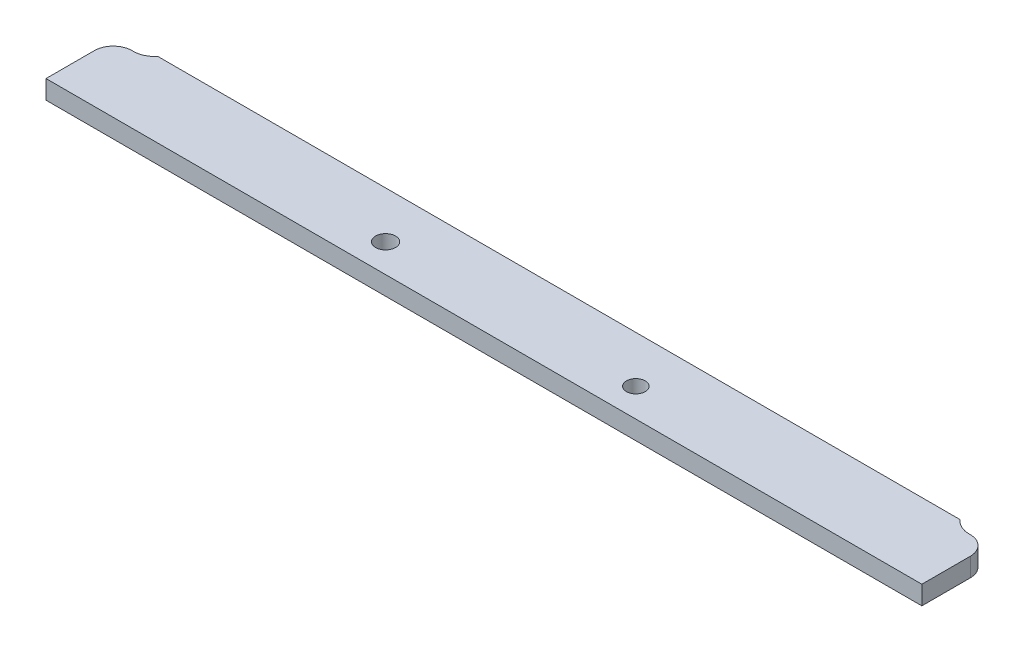
ISO-10303-21;
HEADER;
FILE_DESCRIPTION(('STEP AP214'),'2;1');
FILE_NAME('part.step','',(''),(''),'','','');
FILE_SCHEMA(('AUTOMOTIVE_DESIGN { 1 0 10303 214 1 1 1 1 }'));
ENDSEC;
DATA;
#1=APPLICATION_CONTEXT('core data for automotive mechanical design processes');
#2=APPLICATION_PROTOCOL_DEFINITION('international standard','automotive_design',2000,#1);
#3=PRODUCT_CONTEXT('',#1,'mechanical');
#4=PRODUCT('Part','Part','',(#3));
#5=PRODUCT_RELATED_PRODUCT_CATEGORY('part','',(#4));
#6=PRODUCT_DEFINITION_FORMATION('','',#4);
#7=PRODUCT_DEFINITION_CONTEXT('part definition',#1,'design');
#8=PRODUCT_DEFINITION('design','',#6,#7);
#9=PRODUCT_DEFINITION_SHAPE('','',#8);
#10=(LENGTH_UNIT() NAMED_UNIT(*) SI_UNIT(.MILLI.,.METRE.));
#11=(NAMED_UNIT(*) PLANE_ANGLE_UNIT() SI_UNIT($,.RADIAN.));
#12=(NAMED_UNIT(*) SI_UNIT($,.STERADIAN.) SOLID_ANGLE_UNIT());
#13=UNCERTAINTY_MEASURE_WITH_UNIT(LENGTH_MEASURE(1.E-05),#10,'distance_accuracy_value','');
#14=(GEOMETRIC_REPRESENTATION_CONTEXT(3) GLOBAL_UNCERTAINTY_ASSIGNED_CONTEXT((#13)) GLOBAL_UNIT_ASSIGNED_CONTEXT((#10,
#11,#12)) REPRESENTATION_CONTEXT('',''));
#15=CARTESIAN_POINT('',(0.,0.,0.));
#16=DIRECTION('',(0.,0.,1.));
#17=DIRECTION('',(1.,0.,0.));
#18=AXIS2_PLACEMENT_3D('',#15,#16,#17);
#19=CARTESIAN_POINT('',(128.180358537518,3.,-28.5998740388004));
#20=DIRECTION('',(0.,-1.,0.));
#21=DIRECTION('',(0.,0.,-1.));
#22=AXIS2_PLACEMENT_3D('',#19,#20,#21);
#23=CYLINDRICAL_SURFACE('',#22,3.5);
#24=CARTESIAN_POINT('',(128.180358537518,0.,-28.5998740388004));
#25=DIRECTION('',(0.,-1.,0.));
#26=DIRECTION('',(0.,0.,1.));
#27=AXIS2_PLACEMENT_3D('',#24,#25,#26);
#28=CIRCLE('',#27,3.5);
#29=CARTESIAN_POINT('',(128.180358537518,0.,-25.0998740388004));
#30=VERTEX_POINT('',#29);
#31=CARTESIAN_POINT('',(125.490280150114,0.,-26.3607942569216));
#32=VERTEX_POINT('',#31);
#33=EDGE_CURVE('E141',#30,#32,#28,.T.);
#34=ORIENTED_EDGE('',*,*,#33,.T.);
#35=DIRECTION('',(0.,-1.,0.));
#36=VECTOR('',#35,1.);
#37=CARTESIAN_POINT('',(125.490280150114,3.,-26.3607942569216));
#38=LINE('',#37,#36);
#39=CARTESIAN_POINT('',(125.490280150114,3.,-26.3607942569216));
#40=VERTEX_POINT('',#39);
#41=EDGE_CURVE('E11',#40,#32,#38,.T.);
#42=ORIENTED_EDGE('',*,*,#41,.F.);
#43=CARTESIAN_POINT('',(128.180358537518,3.,-28.5998740388004));
#44=DIRECTION('',(0.,-1.,0.));
#45=DIRECTION('',(0.,0.,1.));
#46=AXIS2_PLACEMENT_3D('',#43,#44,#45);
#47=CIRCLE('',#46,3.5);
#48=CARTESIAN_POINT('',(128.180358537518,3.,-25.0998740388004));
#49=VERTEX_POINT('',#48);
#50=EDGE_CURVE('E160',#49,#40,#47,.T.);
#51=ORIENTED_EDGE('',*,*,#50,.F.);
#52=DIRECTION('',(0.,-1.,0.));
#53=VECTOR('',#52,1.);
#54=CARTESIAN_POINT('',(128.180358537518,3.,-25.0998740388004));
#55=LINE('',#54,#53);
#56=EDGE_CURVE('E137',#49,#30,#55,.T.);
#57=ORIENTED_EDGE('',*,*,#56,.T.);
#58=EDGE_LOOP('',(#34,#42,#51,#57));
#59=FACE_BOUND('',#58,.T.);
#60=ADVANCED_FACE('F33',(#59),#23,.F.);
#61=CARTESIAN_POINT('',(125.490280150114,3.,-26.3607942569216));
#62=DIRECTION('',(0.,0.,1.));
#63=DIRECTION('',(1.,0.,0.));
#64=AXIS2_PLACEMENT_3D('',#61,#62,#63);
#65=PLANE('',#64);
#66=DIRECTION('',(-1.,0.,0.));
#67=VECTOR('',#66,1.);
#68=CARTESIAN_POINT('',(125.490280150114,0.,-26.3607942569216));
#69=LINE('',#68,#67);
#70=CARTESIAN_POINT('',(-2.74094444966359,0.,-26.3607942569216));
#71=VERTEX_POINT('',#70);
#72=EDGE_CURVE('E144',#32,#71,#69,.T.);
#73=ORIENTED_EDGE('',*,*,#72,.T.);
#74=DIRECTION('',(0.,-1.,0.));
#75=VECTOR('',#74,1.);
#76=CARTESIAN_POINT('',(-2.74094444966359,3.,-26.3607942569216));
#77=LINE('',#76,#75);
#78=CARTESIAN_POINT('',(-2.74094444966359,3.,-26.3607942569216));
#79=VERTEX_POINT('',#78);
#80=EDGE_CURVE('E41',#79,#71,#77,.T.);
#81=ORIENTED_EDGE('',*,*,#80,.F.);
#82=DIRECTION('',(-1.,0.,0.));
#83=VECTOR('',#82,1.);
#84=CARTESIAN_POINT('',(125.490280150114,3.,-26.3607942569216));
#85=LINE('',#84,#83);
#86=EDGE_CURVE('E98',#40,#79,#85,.T.);
#87=ORIENTED_EDGE('',*,*,#86,.F.);
#88=ORIENTED_EDGE('',*,*,#41,.T.);
#89=EDGE_LOOP('',(#73,#81,#87,#88));
#90=FACE_BOUND('',#89,.T.);
#91=ADVANCED_FACE('F242',(#90),#65,.F.);
#92=CARTESIAN_POINT('',(-5.43102283706826,3.,-28.5998740388004));
#93=DIRECTION('',(0.,-1.,0.));
#94=DIRECTION('',(0.,0.,-1.));
#95=AXIS2_PLACEMENT_3D('',#92,#93,#94);
#96=CYLINDRICAL_SURFACE('',#95,3.5);
#97=CARTESIAN_POINT('',(-5.43102283706826,0.,-28.5998740388004));
#98=DIRECTION('',(0.,-1.,0.));
#99=DIRECTION('',(0.,0.,1.));
#100=AXIS2_PLACEMENT_3D('',#97,#98,#99);
#101=CIRCLE('',#100,3.5);
#102=CARTESIAN_POINT('',(-5.43102283706826,0.,-25.0998740388004));
#103=VERTEX_POINT('',#102);
#104=EDGE_CURVE('E147',#71,#103,#101,.T.);
#105=ORIENTED_EDGE('',*,*,#104,.T.);
#106=DIRECTION('',(0.,-1.,0.));
#107=VECTOR('',#106,1.);
#108=CARTESIAN_POINT('',(-5.43102283706826,3.,-25.0998740388004));
#109=LINE('',#108,#107);
#110=CARTESIAN_POINT('',(-5.43102283706826,3.,-25.0998740388004));
#111=VERTEX_POINT('',#110);
#112=EDGE_CURVE('E173',#111,#103,#109,.T.);
#113=ORIENTED_EDGE('',*,*,#112,.F.);
#114=CARTESIAN_POINT('',(-5.43102283706826,3.,-28.5998740388004));
#115=DIRECTION('',(0.,-1.,0.));
#116=DIRECTION('',(0.,0.,1.));
#117=AXIS2_PLACEMENT_3D('',#114,#115,#116);
#118=CIRCLE('',#117,3.5);
#119=EDGE_CURVE('E181',#79,#111,#118,.T.);
#120=ORIENTED_EDGE('',*,*,#119,.F.);
#121=ORIENTED_EDGE('',*,*,#80,.T.);
#122=EDGE_LOOP('',(#105,#113,#120,#121));
#123=FACE_BOUND('',#122,.T.);
#124=ADVANCED_FACE('F179',(#123),#96,.F.);
#125=CARTESIAN_POINT('',(-5.43102283706826,3.,-25.0998740388004));
#126=DIRECTION('',(0.,0.,1.));
#127=DIRECTION('',(1.,0.,0.));
#128=AXIS2_PLACEMENT_3D('',#125,#126,#127);
#129=PLANE('',#128);
#130=DIRECTION('',(-1.,0.,0.));
#131=VECTOR('',#130,1.);
#132=CARTESIAN_POINT('',(-5.43102283706826,0.,-25.0998740388004));
#133=LINE('',#132,#131);
#134=CARTESIAN_POINT('',(-5.62533214977496,0.,-25.0998740388004));
#135=VERTEX_POINT('',#134);
#136=EDGE_CURVE('E149',#103,#135,#133,.T.);
#137=ORIENTED_EDGE('',*,*,#136,.T.);
#138=DIRECTION('',(0.,-1.,0.));
#139=VECTOR('',#138,1.);
#140=CARTESIAN_POINT('',(-5.62533214977496,3.,-25.0998740388004));
#141=LINE('',#140,#139);
#142=CARTESIAN_POINT('',(-5.62533214977496,3.,-25.0998740388004));
#143=VERTEX_POINT('',#142);
#144=EDGE_CURVE('E170',#143,#135,#141,.T.);
#145=ORIENTED_EDGE('',*,*,#144,.F.);
#146=DIRECTION('',(-1.,0.,0.));
#147=VECTOR('',#146,1.);
#148=CARTESIAN_POINT('',(-5.43102283706826,3.,-25.0998740388004));
#149=LINE('',#148,#147);
#150=EDGE_CURVE('E199',#111,#143,#149,.T.);
#151=ORIENTED_EDGE('',*,*,#150,.F.);
#152=ORIENTED_EDGE('',*,*,#112,.T.);
#153=EDGE_LOOP('',(#137,#145,#151,#152));
#154=FACE_BOUND('',#153,.T.);
#155=ADVANCED_FACE('F190',(#154),#129,.F.);
#156=CARTESIAN_POINT('',(-5.62533214977497,3.,-22.0998740388004));
#157=DIRECTION('',(0.,-1.,0.));
#158=DIRECTION('',(0.,0.,-1.));
#159=AXIS2_PLACEMENT_3D('',#156,#157,#158);
#160=CYLINDRICAL_SURFACE('',#159,3.);
#161=CARTESIAN_POINT('',(-5.62533214977497,0.,-22.0998740388004));
#162=DIRECTION('',(0.,1.,0.));
#163=DIRECTION('',(0.,0.,1.));
#164=AXIS2_PLACEMENT_3D('',#161,#162,#163);
#165=CIRCLE('',#164,3.);
#166=CARTESIAN_POINT('',(-8.62533214977497,0.,-22.0998740388004));
#167=VERTEX_POINT('',#166);
#168=EDGE_CURVE('E151',#135,#167,#165,.T.);
#169=ORIENTED_EDGE('',*,*,#168,.T.);
#170=DIRECTION('',(0.,-1.,0.));
#171=VECTOR('',#170,1.);
#172=CARTESIAN_POINT('',(-8.62533214977497,3.,-22.0998740388004));
#173=LINE('',#172,#171);
#174=CARTESIAN_POINT('',(-8.62533214977497,3.,-22.0998740388004));
#175=VERTEX_POINT('',#174);
#176=EDGE_CURVE('E167',#175,#167,#173,.T.);
#177=ORIENTED_EDGE('',*,*,#176,.F.);
#178=CARTESIAN_POINT('',(-5.62533214977497,3.,-22.0998740388004));
#179=DIRECTION('',(0.,1.,0.));
#180=DIRECTION('',(0.,0.,1.));
#181=AXIS2_PLACEMENT_3D('',#178,#179,#180);
#182=CIRCLE('',#181,3.);
#183=EDGE_CURVE('E196',#143,#175,#182,.T.);
#184=ORIENTED_EDGE('',*,*,#183,.F.);
#185=ORIENTED_EDGE('',*,*,#144,.T.);
#186=EDGE_LOOP('',(#169,#177,#184,#185));
#187=FACE_BOUND('',#186,.T.);
#188=ADVANCED_FACE('F194',(#187),#160,.T.);
#189=CARTESIAN_POINT('',(-8.62533214977497,3.,-22.0998740388004));
#190=DIRECTION('',(1.,0.,0.));
#191=DIRECTION('',(0.,0.,-1.));
#192=AXIS2_PLACEMENT_3D('',#189,#190,#191);
#193=PLANE('',#192);
#194=DIRECTION('',(0.,0.,1.));
#195=VECTOR('',#194,1.);
#196=CARTESIAN_POINT('',(-8.62533214977497,0.,-22.0998740388004));
#197=LINE('',#196,#195);
#198=CARTESIAN_POINT('',(-8.62533214977497,0.,-14.3588941767466));
#199=VERTEX_POINT('',#198);
#200=EDGE_CURVE('E153',#167,#199,#197,.T.);
#201=ORIENTED_EDGE('',*,*,#200,.T.);
#202=DIRECTION('',(0.,-1.,0.));
#203=VECTOR('',#202,1.);
#204=CARTESIAN_POINT('',(-8.62533214977497,3.,-14.3588941767466));
#205=LINE('',#204,#203);
#206=CARTESIAN_POINT('',(-8.62533214977497,3.,-14.3588941767466));
#207=VERTEX_POINT('',#206);
#208=EDGE_CURVE('E164',#207,#199,#205,.T.);
#209=ORIENTED_EDGE('',*,*,#208,.F.);
#210=DIRECTION('',(0.,0.,1.));
#211=VECTOR('',#210,1.);
#212=CARTESIAN_POINT('',(-8.62533214977497,3.,-22.0998740388004));
#213=LINE('',#212,#211);
#214=EDGE_CURVE('E198',#175,#207,#213,.T.);
#215=ORIENTED_EDGE('',*,*,#214,.F.);
#216=ORIENTED_EDGE('',*,*,#176,.T.);
#217=EDGE_LOOP('',(#201,#209,#215,#216));
#218=FACE_BOUND('',#217,.T.);
#219=ADVANCED_FACE('F254',(#218),#193,.F.);
#220=CARTESIAN_POINT('',(-8.62533214977497,3.,-14.3588941767466));
#221=DIRECTION('',(0.,0.,-1.));
#222=DIRECTION('',(-1.,0.,0.));
#223=AXIS2_PLACEMENT_3D('',#220,#221,#222);
#224=PLANE('',#223);
#225=DIRECTION('',(1.,0.,0.));
#226=VECTOR('',#225,1.);
#227=CARTESIAN_POINT('',(-8.62533214977497,0.,-14.3588941767466));
#228=LINE('',#227,#226);
#229=CARTESIAN_POINT('',(131.374667850225,0.,-14.3588941767466));
#230=VERTEX_POINT('',#229);
#231=EDGE_CURVE('E155',#199,#230,#228,.T.);
#232=ORIENTED_EDGE('',*,*,#231,.T.);
#233=DIRECTION('',(0.,-1.,0.));
#234=VECTOR('',#233,1.);
#235=CARTESIAN_POINT('',(131.374667850225,3.,-14.3588941767466));
#236=LINE('',#235,#234);
#237=CARTESIAN_POINT('',(131.374667850225,3.,-14.3588941767466));
#238=VERTEX_POINT('',#237);
#239=EDGE_CURVE('E132',#238,#230,#236,.T.);
#240=ORIENTED_EDGE('',*,*,#239,.F.);
#241=DIRECTION('',(1.,0.,0.));
#242=VECTOR('',#241,1.);
#243=CARTESIAN_POINT('',(-8.62533214977497,3.,-14.3588941767466));
#244=LINE('',#243,#242);
#245=EDGE_CURVE('E123',#207,#238,#244,.T.);
#246=ORIENTED_EDGE('',*,*,#245,.F.);
#247=ORIENTED_EDGE('',*,*,#208,.T.);
#248=EDGE_LOOP('',(#232,#240,#246,#247));
#249=FACE_BOUND('',#248,.T.);
#250=ADVANCED_FACE('F251',(#249),#224,.F.);
#251=CARTESIAN_POINT('',(131.374667850225,3.,-14.3588941767466));
#252=DIRECTION('',(-1.,0.,0.));
#253=DIRECTION('',(0.,0.,1.));
#254=AXIS2_PLACEMENT_3D('',#251,#252,#253);
#255=PLANE('',#254);
#256=DIRECTION('',(0.,0.,-1.));
#257=VECTOR('',#256,1.);
#258=CARTESIAN_POINT('',(131.374667850225,0.,-14.3588941767466));
#259=LINE('',#258,#257);
#260=CARTESIAN_POINT('',(131.374667850225,0.,-22.0998740388004));
#261=VERTEX_POINT('',#260);
#262=EDGE_CURVE('E131',#230,#261,#259,.T.);
#263=ORIENTED_EDGE('',*,*,#262,.T.);
#264=DIRECTION('',(0.,-1.,0.));
#265=VECTOR('',#264,1.);
#266=CARTESIAN_POINT('',(131.374667850225,3.,-22.0998740388004));
#267=LINE('',#266,#265);
#268=CARTESIAN_POINT('',(131.374667850225,3.,-22.0998740388004));
#269=VERTEX_POINT('',#268);
#270=EDGE_CURVE('E128',#269,#261,#267,.T.);
#271=ORIENTED_EDGE('',*,*,#270,.F.);
#272=DIRECTION('',(0.,0.,-1.));
#273=VECTOR('',#272,1.);
#274=CARTESIAN_POINT('',(131.374667850225,3.,-14.3588941767466));
#275=LINE('',#274,#273);
#276=EDGE_CURVE('E117',#238,#269,#275,.T.);
#277=ORIENTED_EDGE('',*,*,#276,.F.);
#278=ORIENTED_EDGE('',*,*,#239,.T.);
#279=EDGE_LOOP('',(#263,#271,#277,#278));
#280=FACE_BOUND('',#279,.T.);
#281=ADVANCED_FACE('F129',(#280),#255,.F.);
#282=CARTESIAN_POINT('',(128.374667850225,3.,-22.0998740388004));
#283=DIRECTION('',(0.,-1.,0.));
#284=DIRECTION('',(0.,0.,-1.));
#285=AXIS2_PLACEMENT_3D('',#282,#283,#284);
#286=CYLINDRICAL_SURFACE('',#285,3.);
#287=CARTESIAN_POINT('',(128.374667850225,0.,-22.0998740388004));
#288=DIRECTION('',(0.,1.,0.));
#289=DIRECTION('',(0.,0.,1.));
#290=AXIS2_PLACEMENT_3D('',#287,#288,#289);
#291=CIRCLE('',#290,3.);
#292=CARTESIAN_POINT('',(128.374667850225,0.,-25.0998740388004));
#293=VERTEX_POINT('',#292);
#294=EDGE_CURVE('E84',#261,#293,#291,.T.);
#295=ORIENTED_EDGE('',*,*,#294,.T.);
#296=DIRECTION('',(0.,-1.,0.));
#297=VECTOR('',#296,1.);
#298=CARTESIAN_POINT('',(128.374667850225,3.,-25.0998740388004));
#299=LINE('',#298,#297);
#300=CARTESIAN_POINT('',(128.374667850225,3.,-25.0998740388004));
#301=VERTEX_POINT('',#300);
#302=EDGE_CURVE('E133',#301,#293,#299,.T.);
#303=ORIENTED_EDGE('',*,*,#302,.F.);
#304=CARTESIAN_POINT('',(128.374667850225,3.,-22.0998740388004));
#305=DIRECTION('',(0.,1.,0.));
#306=DIRECTION('',(0.,0.,1.));
#307=AXIS2_PLACEMENT_3D('',#304,#305,#306);
#308=CIRCLE('',#307,3.);
#309=EDGE_CURVE('E121',#269,#301,#308,.T.);
#310=ORIENTED_EDGE('',*,*,#309,.F.);
#311=ORIENTED_EDGE('',*,*,#270,.T.);
#312=EDGE_LOOP('',(#295,#303,#310,#311));
#313=FACE_BOUND('',#312,.T.);
#314=ADVANCED_FACE('F135',(#313),#286,.T.);
#315=CARTESIAN_POINT('',(128.374667850225,3.,-25.0998740388004));
#316=DIRECTION('',(0.,0.,1.));
#317=DIRECTION('',(1.,0.,0.));
#318=AXIS2_PLACEMENT_3D('',#315,#316,#317);
#319=PLANE('',#318);
#320=DIRECTION('',(-1.,0.,0.));
#321=VECTOR('',#320,1.);
#322=CARTESIAN_POINT('',(128.374667850225,0.,-25.0998740388004));
#323=LINE('',#322,#321);
#324=EDGE_CURVE('E90',#293,#30,#323,.T.);
#325=ORIENTED_EDGE('',*,*,#324,.T.);
#326=ORIENTED_EDGE('',*,*,#56,.F.);
#327=DIRECTION('',(-1.,0.,0.));
#328=VECTOR('',#327,1.);
#329=CARTESIAN_POINT('',(128.374667850225,3.,-25.0998740388004));
#330=LINE('',#329,#328);
#331=EDGE_CURVE('E49',#301,#49,#330,.T.);
#332=ORIENTED_EDGE('',*,*,#331,.F.);
#333=ORIENTED_EDGE('',*,*,#302,.T.);
#334=EDGE_LOOP('',(#325,#326,#332,#333));
#335=FACE_BOUND('',#334,.T.);
#336=ADVANCED_FACE('F224',(#335),#319,.F.);
#337=CARTESIAN_POINT('',(128.180358537518,3.,-28.5998740388004));
#338=DIRECTION('',(0.,1.,0.));
#339=DIRECTION('',(0.,0.,1.));
#340=AXIS2_PLACEMENT_3D('',#337,#338,#339);
#341=PLANE('',#340);
#342=CARTESIAN_POINT('',(41.1097970990968,3.,-18.9031140667815));
#343=DIRECTION('',(0.,1.,0.));
#344=DIRECTION('',(0.,0.,1.));
#345=AXIS2_PLACEMENT_3D('',#342,#343,#344);
#346=CIRCLE('',#345,1.6);
#347=CARTESIAN_POINT('',(41.1097970990968,3.,-17.3031140667815));
#348=VERTEX_POINT('',#347);
#349=EDGE_CURVE('E210',#348,#348,#346,.T.);
#350=ORIENTED_EDGE('',*,*,#349,.F.);
#351=EDGE_LOOP('',(#350));
#352=FACE_BOUND('',#351,.T.);
#353=CARTESIAN_POINT('',(81.1097970990968,3.,-18.9031140667815));
#354=DIRECTION('',(0.,1.,0.));
#355=DIRECTION('',(0.,0.,1.));
#356=AXIS2_PLACEMENT_3D('',#353,#354,#355);
#357=CIRCLE('',#356,1.5);
#358=CARTESIAN_POINT('',(81.1097970990968,3.,-17.4031140667815));
#359=VERTEX_POINT('',#358);
#360=EDGE_CURVE('E211',#359,#359,#357,.T.);
#361=ORIENTED_EDGE('',*,*,#360,.F.);
#362=EDGE_LOOP('',(#361));
#363=FACE_BOUND('',#362,.T.);
#364=ORIENTED_EDGE('',*,*,#50,.T.);
#365=ORIENTED_EDGE('',*,*,#86,.T.);
#366=ORIENTED_EDGE('',*,*,#119,.T.);
#367=ORIENTED_EDGE('',*,*,#150,.T.);
#368=ORIENTED_EDGE('',*,*,#183,.T.);
#369=ORIENTED_EDGE('',*,*,#214,.T.);
#370=ORIENTED_EDGE('',*,*,#245,.T.);
#371=ORIENTED_EDGE('',*,*,#276,.T.);
#372=ORIENTED_EDGE('',*,*,#309,.T.);
#373=ORIENTED_EDGE('',*,*,#331,.T.);
#374=EDGE_LOOP('',(#364,#365,#366,#367,#368,#369,#370,#371,#372,#373));
#375=FACE_BOUND('',#374,.T.);
#376=ADVANCED_FACE('F119',(#352,#363,#375),#341,.T.);
#377=CARTESIAN_POINT('',(128.180358537518,0.,-28.5998740388004));
#378=DIRECTION('',(0.,1.,0.));
#379=DIRECTION('',(0.,0.,1.));
#380=AXIS2_PLACEMENT_3D('',#377,#378,#379);
#381=PLANE('',#380);
#382=CARTESIAN_POINT('',(41.1097970990968,0.,-18.9031140667815));
#383=DIRECTION('',(0.,1.,0.));
#384=DIRECTION('',(0.,0.,1.));
#385=AXIS2_PLACEMENT_3D('',#382,#383,#384);
#386=CIRCLE('',#385,1.6);
#387=CARTESIAN_POINT('',(41.1097970990968,0.,-17.3031140667815));
#388=VERTEX_POINT('',#387);
#389=EDGE_CURVE('E145',#388,#388,#386,.F.);
#390=ORIENTED_EDGE('',*,*,#389,.F.);
#391=EDGE_LOOP('',(#390));
#392=FACE_BOUND('',#391,.T.);
#393=CARTESIAN_POINT('',(81.1097970990968,0.,-18.9031140667815));
#394=DIRECTION('',(0.,1.,0.));
#395=DIRECTION('',(0.,0.,1.));
#396=AXIS2_PLACEMENT_3D('',#393,#394,#395);
#397=CIRCLE('',#396,1.5);
#398=CARTESIAN_POINT('',(81.1097970990968,0.,-17.4031140667815));
#399=VERTEX_POINT('',#398);
#400=EDGE_CURVE('E207',#399,#399,#397,.F.);
#401=ORIENTED_EDGE('',*,*,#400,.F.);
#402=EDGE_LOOP('',(#401));
#403=FACE_BOUND('',#402,.T.);
#404=ORIENTED_EDGE('',*,*,#33,.F.);
#405=ORIENTED_EDGE('',*,*,#324,.F.);
#406=ORIENTED_EDGE('',*,*,#294,.F.);
#407=ORIENTED_EDGE('',*,*,#262,.F.);
#408=ORIENTED_EDGE('',*,*,#231,.F.);
#409=ORIENTED_EDGE('',*,*,#200,.F.);
#410=ORIENTED_EDGE('',*,*,#168,.F.);
#411=ORIENTED_EDGE('',*,*,#136,.F.);
#412=ORIENTED_EDGE('',*,*,#104,.F.);
#413=ORIENTED_EDGE('',*,*,#72,.F.);
#414=EDGE_LOOP('',(#404,#405,#406,#407,#408,#409,#410,#411,#412,#413));
#415=FACE_BOUND('',#414,.T.);
#416=ADVANCED_FACE('F185',(#392,#403,#415),#381,.F.);
#417=CARTESIAN_POINT('',(81.1097970990968,-0.00100000000000013,-18.9031140667815));
#418=DIRECTION('',(0.,1.,0.));
#419=DIRECTION('',(0.,0.,1.));
#420=AXIS2_PLACEMENT_3D('',#417,#418,#419);
#421=CYLINDRICAL_SURFACE('',#420,1.5);
#422=CARTESIAN_POINT('',(81.1097970990968,3.,-17.4031140667815));
#423=CARTESIAN_POINT('',(81.1097970990968,2.96875,-17.4031140667815));
#424=CARTESIAN_POINT('',(81.1097970990968,2.9375,-17.4031140667815));
#425=CARTESIAN_POINT('',(81.1097970990968,2.875,-17.4031140667815));
#426=CARTESIAN_POINT('',(81.1097970990968,2.84375,-17.4031140667815));
#427=CARTESIAN_POINT('',(81.1097970990968,2.78125,-17.4031140667815));
#428=CARTESIAN_POINT('',(81.1097970990968,2.75,-17.4031140667815));
#429=CARTESIAN_POINT('',(81.1097970990968,2.6875,-17.4031140667815));
#430=CARTESIAN_POINT('',(81.1097970990968,2.65625,-17.4031140667815));
#431=CARTESIAN_POINT('',(81.1097970990968,2.59375,-17.4031140667815));
#432=CARTESIAN_POINT('',(81.1097970990968,2.5625,-17.4031140667815));
#433=CARTESIAN_POINT('',(81.1097970990968,2.5,-17.4031140667815));
#434=CARTESIAN_POINT('',(81.1097970990968,2.46875,-17.4031140667815));
#435=CARTESIAN_POINT('',(81.1097970990968,2.40625,-17.4031140667815));
#436=CARTESIAN_POINT('',(81.1097970990968,2.375,-17.4031140667815));
#437=CARTESIAN_POINT('',(81.1097970990968,2.3125,-17.4031140667815));
#438=CARTESIAN_POINT('',(81.1097970990968,2.28125,-17.4031140667815));
#439=CARTESIAN_POINT('',(81.1097970990968,2.21875,-17.4031140667815));
#440=CARTESIAN_POINT('',(81.1097970990968,2.1875,-17.4031140667815));
#441=CARTESIAN_POINT('',(81.1097970990968,2.125,-17.4031140667815));
#442=CARTESIAN_POINT('',(81.1097970990968,2.09375,-17.4031140667815));
#443=CARTESIAN_POINT('',(81.1097970990968,2.03125,-17.4031140667815));
#444=CARTESIAN_POINT('',(81.1097970990968,2.,-17.4031140667815));
#445=CARTESIAN_POINT('',(81.1097970990968,1.9375,-17.4031140667815));
#446=CARTESIAN_POINT('',(81.1097970990968,1.90625,-17.4031140667815));
#447=CARTESIAN_POINT('',(81.1097970990968,1.84375,-17.4031140667815));
#448=CARTESIAN_POINT('',(81.1097970990968,1.8125,-17.4031140667815));
#449=CARTESIAN_POINT('',(81.1097970990968,1.75,-17.4031140667815));
#450=CARTESIAN_POINT('',(81.1097970990968,1.71875,-17.4031140667815));
#451=CARTESIAN_POINT('',(81.1097970990968,1.65625,-17.4031140667815));
#452=CARTESIAN_POINT('',(81.1097970990968,1.625,-17.4031140667815));
#453=CARTESIAN_POINT('',(81.1097970990968,1.5625,-17.4031140667815));
#454=CARTESIAN_POINT('',(81.1097970990968,1.53125,-17.4031140667815));
#455=CARTESIAN_POINT('',(81.1097970990968,1.46875,-17.4031140667815));
#456=CARTESIAN_POINT('',(81.1097970990968,1.4375,-17.4031140667815));
#457=CARTESIAN_POINT('',(81.1097970990968,1.375,-17.4031140667815));
#458=CARTESIAN_POINT('',(81.1097970990968,1.34375,-17.4031140667815));
#459=CARTESIAN_POINT('',(81.1097970990968,1.28125,-17.4031140667815));
#460=CARTESIAN_POINT('',(81.1097970990968,1.25,-17.4031140667815));
#461=CARTESIAN_POINT('',(81.1097970990968,1.1875,-17.4031140667815));
#462=CARTESIAN_POINT('',(81.1097970990968,1.15625,-17.4031140667815));
#463=CARTESIAN_POINT('',(81.1097970990968,1.09375,-17.4031140667815));
#464=CARTESIAN_POINT('',(81.1097970990968,1.0625,-17.4031140667815));
#465=CARTESIAN_POINT('',(81.1097970990968,1.,-17.4031140667815));
#466=CARTESIAN_POINT('',(81.1097970990968,0.96875,-17.4031140667815));
#467=CARTESIAN_POINT('',(81.1097970990968,0.90625,-17.4031140667815));
#468=CARTESIAN_POINT('',(81.1097970990968,0.875,-17.4031140667815));
#469=CARTESIAN_POINT('',(81.1097970990968,0.8125,-17.4031140667815));
#470=CARTESIAN_POINT('',(81.1097970990968,0.78125,-17.4031140667815));
#471=CARTESIAN_POINT('',(81.1097970990968,0.71875,-17.4031140667815));
#472=CARTESIAN_POINT('',(81.1097970990968,0.6875,-17.4031140667815));
#473=CARTESIAN_POINT('',(81.1097970990968,0.625,-17.4031140667815));
#474=CARTESIAN_POINT('',(81.1097970990968,0.59375,-17.4031140667815));
#475=CARTESIAN_POINT('',(81.1097970990968,0.53125,-17.4031140667815));
#476=CARTESIAN_POINT('',(81.1097970990968,0.5,-17.4031140667815));
#477=CARTESIAN_POINT('',(81.1097970990968,0.4375,-17.4031140667815));
#478=CARTESIAN_POINT('',(81.1097970990968,0.40625,-17.4031140667815));
#479=CARTESIAN_POINT('',(81.1097970990968,0.34375,-17.4031140667815));
#480=CARTESIAN_POINT('',(81.1097970990968,0.3125,-17.4031140667815));
#481=CARTESIAN_POINT('',(81.1097970990968,0.25,-17.4031140667815));
#482=CARTESIAN_POINT('',(81.1097970990968,0.21875,-17.4031140667815));
#483=CARTESIAN_POINT('',(81.1097970990968,0.15625,-17.4031140667815));
#484=CARTESIAN_POINT('',(81.1097970990968,0.125,-17.4031140667815));
#485=CARTESIAN_POINT('',(81.1097970990968,0.0625000000000001,-17.4031140667815));
#486=CARTESIAN_POINT('',(81.1097970990968,0.0312500000000001,-17.4031140667815));
#487=CARTESIAN_POINT('',(81.1097970990968,0.,-17.4031140667815));
#488=B_SPLINE_CURVE_WITH_KNOTS('',3,(#422,#423,#424,#425,#426,#427,#428,#429,#430,#431,#432,
#433,#434,#435,#436,#437,#438,#439,#440,#441,#442,#443,#444,#445,#446,#447,#448,#449,#450,#451,
#452,#453,#454,#455,#456,#457,#458,#459,#460,#461,#462,#463,#464,#465,#466,#467,#468,#469,#470,
#471,#472,#473,#474,#475,#476,#477,#478,#479,#480,#481,#482,#483,#484,#485,#486,#487),
.UNSPECIFIED.,.F.,.F.,(4,2,2,2,2,2,2,2,2,2,2,2,2,2,2,2,2,2,2,2,2,2,2,2,2,2,2,2,2,2,2,2,4),(0.,
0.0937500000000001,0.1875,0.28125,0.375,0.46875,0.5625,0.65625,0.75,0.84375,0.9375,1.03125,
1.125,1.21875,1.3125,1.40625,1.5,1.59375,1.6875,1.78125,1.875,1.96875,2.0625,2.15625,2.25,
2.34375,2.4375,2.53125,2.625,2.71875,2.8125,2.90625,3.),.UNSPECIFIED.);
#489=EDGE_CURVE('BSEAM228',#359,#399,#488,.T.);
#490=ORIENTED_EDGE('',*,*,#360,.T.);
#491=ORIENTED_EDGE('',*,*,#400,.T.);
#492=ORIENTED_EDGE('',*,*,#489,.T.);
#493=ORIENTED_EDGE('',*,*,#489,.F.);
#494=EDGE_LOOP('',(#490,#492,#491,#493));
#495=FACE_BOUND('',#494,.T.);
#496=ADVANCED_FACE('F228',(#495),#421,.F.);
#497=CARTESIAN_POINT('',(41.1097970990968,-0.00100000000000013,-18.9031140667815));
#498=DIRECTION('',(0.,1.,0.));
#499=DIRECTION('',(0.,0.,1.));
#500=AXIS2_PLACEMENT_3D('',#497,#498,#499);
#501=CYLINDRICAL_SURFACE('',#500,1.6);
#502=CARTESIAN_POINT('',(41.1097970990968,3.,-17.3031140667815));
#503=CARTESIAN_POINT('',(41.1097970990968,2.96875,-17.3031140667815));
#504=CARTESIAN_POINT('',(41.1097970990968,2.9375,-17.3031140667815));
#505=CARTESIAN_POINT('',(41.1097970990968,2.875,-17.3031140667815));
#506=CARTESIAN_POINT('',(41.1097970990968,2.84375,-17.3031140667815));
#507=CARTESIAN_POINT('',(41.1097970990968,2.78125,-17.3031140667815));
#508=CARTESIAN_POINT('',(41.1097970990968,2.75,-17.3031140667815));
#509=CARTESIAN_POINT('',(41.1097970990968,2.6875,-17.3031140667815));
#510=CARTESIAN_POINT('',(41.1097970990968,2.65625,-17.3031140667815));
#511=CARTESIAN_POINT('',(41.1097970990968,2.59375,-17.3031140667815));
#512=CARTESIAN_POINT('',(41.1097970990968,2.5625,-17.3031140667815));
#513=CARTESIAN_POINT('',(41.1097970990968,2.5,-17.3031140667815));
#514=CARTESIAN_POINT('',(41.1097970990968,2.46875,-17.3031140667815));
#515=CARTESIAN_POINT('',(41.1097970990968,2.40625,-17.3031140667815));
#516=CARTESIAN_POINT('',(41.1097970990968,2.375,-17.3031140667815));
#517=CARTESIAN_POINT('',(41.1097970990968,2.3125,-17.3031140667815));
#518=CARTESIAN_POINT('',(41.1097970990968,2.28125,-17.3031140667815));
#519=CARTESIAN_POINT('',(41.1097970990968,2.21875,-17.3031140667815));
#520=CARTESIAN_POINT('',(41.1097970990968,2.1875,-17.3031140667815));
#521=CARTESIAN_POINT('',(41.1097970990968,2.125,-17.3031140667815));
#522=CARTESIAN_POINT('',(41.1097970990968,2.09375,-17.3031140667815));
#523=CARTESIAN_POINT('',(41.1097970990968,2.03125,-17.3031140667815));
#524=CARTESIAN_POINT('',(41.1097970990968,2.,-17.3031140667815));
#525=CARTESIAN_POINT('',(41.1097970990968,1.9375,-17.3031140667815));
#526=CARTESIAN_POINT('',(41.1097970990968,1.90625,-17.3031140667815));
#527=CARTESIAN_POINT('',(41.1097970990968,1.84375,-17.3031140667815));
#528=CARTESIAN_POINT('',(41.1097970990968,1.8125,-17.3031140667815));
#529=CARTESIAN_POINT('',(41.1097970990968,1.75,-17.3031140667815));
#530=CARTESIAN_POINT('',(41.1097970990968,1.71875,-17.3031140667815));
#531=CARTESIAN_POINT('',(41.1097970990968,1.65625,-17.3031140667815));
#532=CARTESIAN_POINT('',(41.1097970990968,1.625,-17.3031140667815));
#533=CARTESIAN_POINT('',(41.1097970990968,1.5625,-17.3031140667815));
#534=CARTESIAN_POINT('',(41.1097970990968,1.53125,-17.3031140667815));
#535=CARTESIAN_POINT('',(41.1097970990968,1.46875,-17.3031140667815));
#536=CARTESIAN_POINT('',(41.1097970990968,1.4375,-17.3031140667815));
#537=CARTESIAN_POINT('',(41.1097970990968,1.375,-17.3031140667815));
#538=CARTESIAN_POINT('',(41.1097970990968,1.34375,-17.3031140667815));
#539=CARTESIAN_POINT('',(41.1097970990968,1.28125,-17.3031140667815));
#540=CARTESIAN_POINT('',(41.1097970990968,1.25,-17.3031140667815));
#541=CARTESIAN_POINT('',(41.1097970990968,1.1875,-17.3031140667815));
#542=CARTESIAN_POINT('',(41.1097970990968,1.15625,-17.3031140667815));
#543=CARTESIAN_POINT('',(41.1097970990968,1.09375,-17.3031140667815));
#544=CARTESIAN_POINT('',(41.1097970990968,1.0625,-17.3031140667815));
#545=CARTESIAN_POINT('',(41.1097970990968,1.,-17.3031140667815));
#546=CARTESIAN_POINT('',(41.1097970990968,0.96875,-17.3031140667815));
#547=CARTESIAN_POINT('',(41.1097970990968,0.90625,-17.3031140667815));
#548=CARTESIAN_POINT('',(41.1097970990968,0.875,-17.3031140667815));
#549=CARTESIAN_POINT('',(41.1097970990968,0.8125,-17.3031140667815));
#550=CARTESIAN_POINT('',(41.1097970990968,0.78125,-17.3031140667815));
#551=CARTESIAN_POINT('',(41.1097970990968,0.71875,-17.3031140667815));
#552=CARTESIAN_POINT('',(41.1097970990968,0.6875,-17.3031140667815));
#553=CARTESIAN_POINT('',(41.1097970990968,0.625,-17.3031140667815));
#554=CARTESIAN_POINT('',(41.1097970990968,0.59375,-17.3031140667815));
#555=CARTESIAN_POINT('',(41.1097970990968,0.53125,-17.3031140667815));
#556=CARTESIAN_POINT('',(41.1097970990968,0.5,-17.3031140667815));
#557=CARTESIAN_POINT('',(41.1097970990968,0.4375,-17.3031140667815));
#558=CARTESIAN_POINT('',(41.1097970990968,0.40625,-17.3031140667815));
#559=CARTESIAN_POINT('',(41.1097970990968,0.34375,-17.3031140667815));
#560=CARTESIAN_POINT('',(41.1097970990968,0.3125,-17.3031140667815));
#561=CARTESIAN_POINT('',(41.1097970990968,0.25,-17.3031140667815));
#562=CARTESIAN_POINT('',(41.1097970990968,0.21875,-17.3031140667815));
#563=CARTESIAN_POINT('',(41.1097970990968,0.15625,-17.3031140667815));
#564=CARTESIAN_POINT('',(41.1097970990968,0.125,-17.3031140667815));
#565=CARTESIAN_POINT('',(41.1097970990968,0.0625000000000001,-17.3031140667815));
#566=CARTESIAN_POINT('',(41.1097970990968,0.0312500000000001,-17.3031140667815));
#567=CARTESIAN_POINT('',(41.1097970990968,0.,-17.3031140667815));
#568=B_SPLINE_CURVE_WITH_KNOTS('',3,(#502,#503,#504,#505,#506,#507,#508,#509,#510,#511,#512,
#513,#514,#515,#516,#517,#518,#519,#520,#521,#522,#523,#524,#525,#526,#527,#528,#529,#530,#531,
#532,#533,#534,#535,#536,#537,#538,#539,#540,#541,#542,#543,#544,#545,#546,#547,#548,#549,#550,
#551,#552,#553,#554,#555,#556,#557,#558,#559,#560,#561,#562,#563,#564,#565,#566,#567),
.UNSPECIFIED.,.F.,.F.,(4,2,2,2,2,2,2,2,2,2,2,2,2,2,2,2,2,2,2,2,2,2,2,2,2,2,2,2,2,2,2,2,4),(0.,
0.0937500000000001,0.1875,0.28125,0.375,0.46875,0.5625,0.65625,0.75,0.84375,0.9375,1.03125,
1.125,1.21875,1.3125,1.40625,1.5,1.59375,1.6875,1.78125,1.875,1.96875,2.0625,2.15625,2.25,
2.34375,2.4375,2.53125,2.625,2.71875,2.8125,2.90625,3.),.UNSPECIFIED.);
#569=EDGE_CURVE('BSEAM219',#348,#388,#568,.T.);
#570=ORIENTED_EDGE('',*,*,#349,.T.);
#571=ORIENTED_EDGE('',*,*,#389,.T.);
#572=ORIENTED_EDGE('',*,*,#569,.T.);
#573=ORIENTED_EDGE('',*,*,#569,.F.);
#574=EDGE_LOOP('',(#570,#572,#571,#573));
#575=FACE_BOUND('',#574,.T.);
#576=ADVANCED_FACE('F219',(#575),#501,.F.);
#577=CLOSED_SHELL('',(#60,#91,#124,#155,#188,#219,#250,#281,#314,#336,#376,#416,#496,#576));
#578=MANIFOLD_SOLID_BREP('B2',#577);
#579=ADVANCED_BREP_SHAPE_REPRESENTATION('',(#18,#578),#14);
#580=SHAPE_DEFINITION_REPRESENTATION(#9,#579);
ENDSEC;
END-ISO-10303-21;
